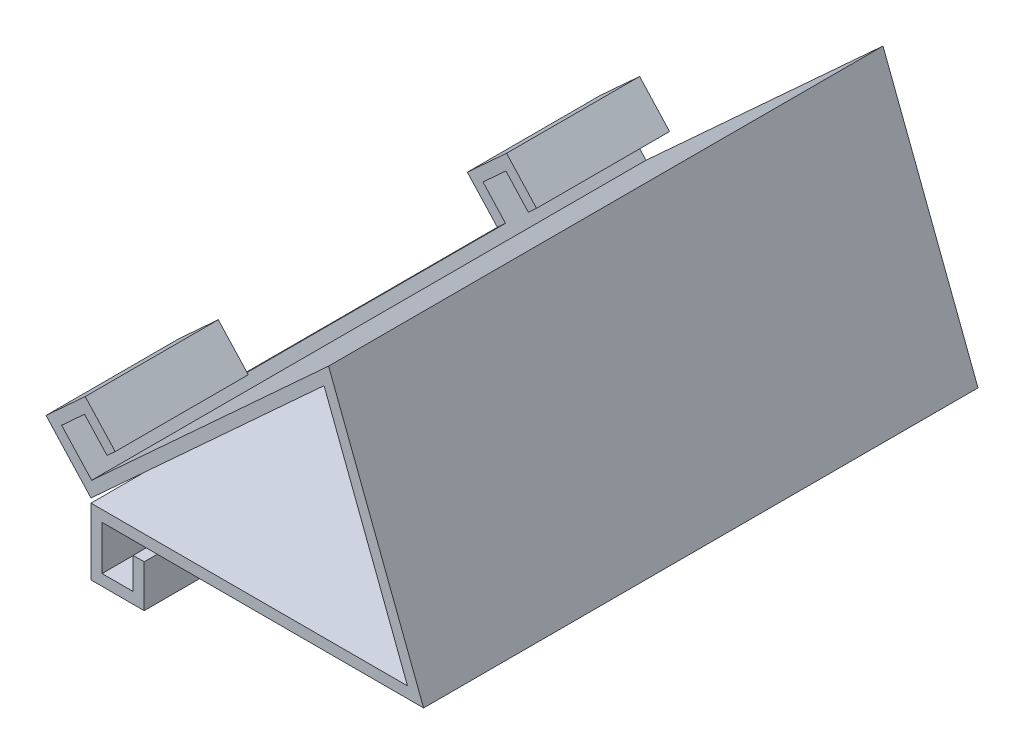
ISO-10303-21;
HEADER;
FILE_DESCRIPTION(('STEP AP214'),'2;1');
FILE_NAME('part.step','',(''),(''),'','','');
FILE_SCHEMA(('AUTOMOTIVE_DESIGN { 1 0 10303 214 1 1 1 1 }'));
ENDSEC;
DATA;
#1=APPLICATION_CONTEXT('core data for automotive mechanical design processes');
#2=APPLICATION_PROTOCOL_DEFINITION('international standard','automotive_design',2000,#1);
#3=PRODUCT_CONTEXT('',#1,'mechanical');
#4=PRODUCT('Part','Part','',(#3));
#5=PRODUCT_RELATED_PRODUCT_CATEGORY('part','',(#4));
#6=PRODUCT_DEFINITION_FORMATION('','',#4);
#7=PRODUCT_DEFINITION_CONTEXT('part definition',#1,'design');
#8=PRODUCT_DEFINITION('design','',#6,#7);
#9=PRODUCT_DEFINITION_SHAPE('','',#8);
#10=(LENGTH_UNIT() NAMED_UNIT(*) SI_UNIT(.MILLI.,.METRE.));
#11=(NAMED_UNIT(*) PLANE_ANGLE_UNIT() SI_UNIT($,.RADIAN.));
#12=(NAMED_UNIT(*) SI_UNIT($,.STERADIAN.) SOLID_ANGLE_UNIT());
#13=UNCERTAINTY_MEASURE_WITH_UNIT(LENGTH_MEASURE(1.E-05),#10,'distance_accuracy_value','');
#14=(GEOMETRIC_REPRESENTATION_CONTEXT(3) GLOBAL_UNCERTAINTY_ASSIGNED_CONTEXT((#13)) GLOBAL_UNIT_ASSIGNED_CONTEXT((#10,
#11,#12)) REPRESENTATION_CONTEXT('',''));
#15=CARTESIAN_POINT('',(0.,0.,0.));
#16=DIRECTION('',(0.,0.,1.));
#17=DIRECTION('',(1.,0.,0.));
#18=AXIS2_PLACEMENT_3D('',#15,#16,#17);
#19=CARTESIAN_POINT('',(0.635,-2.54,31.75));
#20=DIRECTION('',(0.,-1.,0.));
#21=DIRECTION('',(0.,0.,-1.));
#22=AXIS2_PLACEMENT_3D('',#19,#20,#21);
#23=PLANE('',#22);
#24=DIRECTION('',(0.,0.,-1.));
#25=VECTOR('',#24,1.);
#26=CARTESIAN_POINT('',(2.413,-2.54,31.75));
#27=LINE('',#26,#25);
#28=CARTESIAN_POINT('',(2.413,-2.54,31.75));
#29=VERTEX_POINT('',#28);
#30=CARTESIAN_POINT('',(2.413,-2.54,24.13));
#31=VERTEX_POINT('',#30);
#32=EDGE_CURVE('E539',#29,#31,#27,.T.);
#33=ORIENTED_EDGE('',*,*,#32,.T.);
#34=DIRECTION('',(-1.,0.,0.));
#35=VECTOR('',#34,1.);
#36=CARTESIAN_POINT('',(0.635,-2.54,24.13));
#37=LINE('',#36,#35);
#38=CARTESIAN_POINT('',(0.635,-2.54,24.13));
#39=VERTEX_POINT('',#38);
#40=EDGE_CURVE('E336',#31,#39,#37,.T.);
#41=ORIENTED_EDGE('',*,*,#40,.T.);
#42=DIRECTION('',(0.,0.,-1.));
#43=VECTOR('',#42,1.);
#44=CARTESIAN_POINT('',(0.635,-2.54,31.75));
#45=LINE('',#44,#43);
#46=CARTESIAN_POINT('',(0.635,-2.54,31.75));
#47=VERTEX_POINT('',#46);
#48=EDGE_CURVE('E625',#47,#39,#45,.T.);
#49=ORIENTED_EDGE('',*,*,#48,.F.);
#50=DIRECTION('',(-1.,0.,0.));
#51=VECTOR('',#50,1.);
#52=CARTESIAN_POINT('',(0.635,-2.54,31.75));
#53=LINE('',#52,#51);
#54=EDGE_CURVE('E406',#29,#47,#53,.T.);
#55=ORIENTED_EDGE('',*,*,#54,.F.);
#56=EDGE_LOOP('',(#33,#41,#49,#55));
#57=FACE_BOUND('',#56,.T.);
#58=ADVANCED_FACE('F39',(#57),#23,.F.);
#59=CARTESIAN_POINT('',(3.048,-3.175,31.75));
#60=DIRECTION('',(0.,1.,0.));
#61=DIRECTION('',(-1.,0.,0.));
#62=AXIS2_PLACEMENT_3D('',#59,#60,#61);
#63=PLANE('',#62);
#64=DIRECTION('',(0.,0.,-1.));
#65=VECTOR('',#64,1.);
#66=CARTESIAN_POINT('',(0.,-3.175,31.75));
#67=LINE('',#66,#65);
#68=CARTESIAN_POINT('',(0.,-3.175,31.75));
#69=VERTEX_POINT('',#68);
#70=CARTESIAN_POINT('',(0.,-3.175,24.13));
#71=VERTEX_POINT('',#70);
#72=EDGE_CURVE('E559',#69,#71,#67,.T.);
#73=ORIENTED_EDGE('',*,*,#72,.T.);
#74=DIRECTION('',(-1.,0.,0.));
#75=VECTOR('',#74,1.);
#76=CARTESIAN_POINT('',(31.75,-3.175,24.13));
#77=LINE('',#76,#75);
#78=CARTESIAN_POINT('',(3.048,-3.175,24.13));
#79=VERTEX_POINT('',#78);
#80=EDGE_CURVE('E293',#79,#71,#77,.T.);
#81=ORIENTED_EDGE('',*,*,#80,.F.);
#82=DIRECTION('',(0.,0.,-1.));
#83=VECTOR('',#82,1.);
#84=CARTESIAN_POINT('',(3.048,-3.175,31.75));
#85=LINE('',#84,#83);
#86=CARTESIAN_POINT('',(3.048,-3.175,31.75));
#87=VERTEX_POINT('',#86);
#88=EDGE_CURVE('E554',#87,#79,#85,.T.);
#89=ORIENTED_EDGE('',*,*,#88,.F.);
#90=DIRECTION('',(1.,0.,0.));
#91=VECTOR('',#90,1.);
#92=CARTESIAN_POINT('',(3.048,-3.175,31.75));
#93=LINE('',#92,#91);
#94=EDGE_CURVE('E456',#69,#87,#93,.T.);
#95=ORIENTED_EDGE('',*,*,#94,.F.);
#96=EDGE_LOOP('',(#73,#81,#89,#95));
#97=FACE_BOUND('',#96,.T.);
#98=ADVANCED_FACE('F692',(#97),#63,.F.);
#99=CARTESIAN_POINT('',(3.048,-0.750440267258518,31.75));
#100=DIRECTION('',(-1.,0.,0.));
#101=DIRECTION('',(0.,-1.,0.));
#102=AXIS2_PLACEMENT_3D('',#99,#100,#101);
#103=PLANE('',#102);
#104=ORIENTED_EDGE('',*,*,#88,.T.);
#105=DIRECTION('',(0.,1.,0.));
#106=VECTOR('',#105,1.);
#107=CARTESIAN_POINT('',(3.048,-0.750440267258518,24.13));
#108=LINE('',#107,#106);
#109=CARTESIAN_POINT('',(3.048,-0.750440267258518,24.13));
#110=VERTEX_POINT('',#109);
#111=EDGE_CURVE('E332',#79,#110,#108,.T.);
#112=ORIENTED_EDGE('',*,*,#111,.T.);
#113=DIRECTION('',(0.,0.,-1.));
#114=VECTOR('',#113,1.);
#115=CARTESIAN_POINT('',(3.048,-0.750440267258518,31.75));
#116=LINE('',#115,#114);
#117=CARTESIAN_POINT('',(3.048,-0.750440267258518,31.75));
#118=VERTEX_POINT('',#117);
#119=EDGE_CURVE('E549',#118,#110,#116,.T.);
#120=ORIENTED_EDGE('',*,*,#119,.F.);
#121=DIRECTION('',(0.,1.,0.));
#122=VECTOR('',#121,1.);
#123=CARTESIAN_POINT('',(3.048,-0.750440267258518,31.75));
#124=LINE('',#123,#122);
#125=EDGE_CURVE('E459',#87,#118,#124,.T.);
#126=ORIENTED_EDGE('',*,*,#125,.F.);
#127=EDGE_LOOP('',(#104,#112,#120,#126));
#128=FACE_BOUND('',#127,.T.);
#129=ADVANCED_FACE('F689',(#128),#103,.F.);
#130=CARTESIAN_POINT('',(2.413,-0.750440267258518,31.75));
#131=DIRECTION('',(0.,-1.,0.));
#132=DIRECTION('',(0.,0.,-1.));
#133=AXIS2_PLACEMENT_3D('',#130,#131,#132);
#134=PLANE('',#133);
#135=ORIENTED_EDGE('',*,*,#119,.T.);
#136=DIRECTION('',(-1.,0.,0.));
#137=VECTOR('',#136,1.);
#138=CARTESIAN_POINT('',(2.413,-0.750440267258518,24.13));
#139=LINE('',#138,#137);
#140=CARTESIAN_POINT('',(2.413,-0.750440267258518,24.13));
#141=VERTEX_POINT('',#140);
#142=EDGE_CURVE('E328',#110,#141,#139,.T.);
#143=ORIENTED_EDGE('',*,*,#142,.T.);
#144=DIRECTION('',(0.,0.,-1.));
#145=VECTOR('',#144,1.);
#146=CARTESIAN_POINT('',(2.413,-0.750440267258518,31.75));
#147=LINE('',#146,#145);
#148=CARTESIAN_POINT('',(2.413,-0.750440267258518,31.75));
#149=VERTEX_POINT('',#148);
#150=EDGE_CURVE('E544',#149,#141,#147,.T.);
#151=ORIENTED_EDGE('',*,*,#150,.F.);
#152=DIRECTION('',(-1.,0.,0.));
#153=VECTOR('',#152,1.);
#154=CARTESIAN_POINT('',(2.413,-0.750440267258518,31.75));
#155=LINE('',#154,#153);
#156=EDGE_CURVE('E462',#118,#149,#155,.T.);
#157=ORIENTED_EDGE('',*,*,#156,.F.);
#158=EDGE_LOOP('',(#135,#143,#151,#157));
#159=FACE_BOUND('',#158,.T.);
#160=ADVANCED_FACE('F684',(#159),#134,.F.);
#161=CARTESIAN_POINT('',(2.413,-2.54,31.75));
#162=DIRECTION('',(1.,0.,0.));
#163=DIRECTION('',(0.,0.,-1.));
#164=AXIS2_PLACEMENT_3D('',#161,#162,#163);
#165=PLANE('',#164);
#166=ORIENTED_EDGE('',*,*,#150,.T.);
#167=DIRECTION('',(0.,-1.,0.));
#168=VECTOR('',#167,1.);
#169=CARTESIAN_POINT('',(2.413,-2.54,24.13));
#170=LINE('',#169,#168);
#171=EDGE_CURVE('E11',#141,#31,#170,.T.);
#172=ORIENTED_EDGE('',*,*,#171,.T.);
#173=ORIENTED_EDGE('',*,*,#32,.F.);
#174=DIRECTION('',(0.,-1.,0.));
#175=VECTOR('',#174,1.);
#176=CARTESIAN_POINT('',(2.413,-2.54,31.75));
#177=LINE('',#176,#175);
#178=EDGE_CURVE('E465',#149,#29,#177,.T.);
#179=ORIENTED_EDGE('',*,*,#178,.F.);
#180=EDGE_LOOP('',(#166,#172,#173,#179));
#181=FACE_BOUND('',#180,.T.);
#182=ADVANCED_FACE('F681',(#181),#165,.F.);
#183=CARTESIAN_POINT('',(-0.368323494408721,4.85983515188764,31.75));
#184=DIRECTION('',(-0.676031010893319,0.73687317247309,0.));
#185=DIRECTION('',(-0.73687317247309,-0.676031010893319,0.));
#186=AXIS2_PLACEMENT_3D('',#183,#184,#185);
#187=PLANE('',#186);
#188=DIRECTION('',(0.,0.,-1.));
#189=VECTOR('',#188,1.);
#190=CARTESIAN_POINT('',(-0.368323494408721,4.85983515188764,31.75));
#191=LINE('',#190,#189);
#192=CARTESIAN_POINT('',(-0.368323494408721,4.85983515188764,7.62));
#193=VERTEX_POINT('',#192);
#194=CARTESIAN_POINT('',(-0.368323494408721,4.85983515188764,0.));
#195=VERTEX_POINT('',#194);
#196=EDGE_CURVE('E598',#193,#195,#191,.T.);
#197=ORIENTED_EDGE('',*,*,#196,.F.);
#198=DIRECTION('',(-0.73687317247309,-0.676031010893319,0.));
#199=VECTOR('',#198,1.);
#200=CARTESIAN_POINT('',(-0.368323494408721,4.85983515188764,7.62));
#201=LINE('',#200,#199);
#202=CARTESIAN_POINT('',(-1.67848399506588,3.65785201451932,7.62));
#203=VERTEX_POINT('',#202);
#204=EDGE_CURVE('E397',#193,#203,#201,.T.);
#205=ORIENTED_EDGE('',*,*,#204,.T.);
#206=DIRECTION('',(0.,0.,-1.));
#207=VECTOR('',#206,1.);
#208=CARTESIAN_POINT('',(-1.67848399506588,3.65785201451932,31.75));
#209=LINE('',#208,#207);
#210=CARTESIAN_POINT('',(-1.67848399506588,3.65785201451932,0.));
#211=VERTEX_POINT('',#210);
#212=EDGE_CURVE('E603',#203,#211,#209,.T.);
#213=ORIENTED_EDGE('',*,*,#212,.T.);
#214=DIRECTION('',(0.73687317247309,0.676031010893319,0.));
#215=VECTOR('',#214,1.);
#216=CARTESIAN_POINT('',(-0.368323494408721,4.85983515188764,0.));
#217=LINE('',#216,#215);
#218=EDGE_CURVE('E488',#211,#195,#217,.T.);
#219=ORIENTED_EDGE('',*,*,#218,.T.);
#220=EDGE_LOOP('',(#197,#205,#213,#219));
#221=FACE_BOUND('',#220,.T.);
#222=ADVANCED_FACE('F794',(#221),#187,.F.);
#223=CARTESIAN_POINT('',(0.919515581343052,3.45609175832641,31.75));
#224=DIRECTION('',(0.73687317247309,0.676031010893319,0.));
#225=DIRECTION('',(-0.676031010893319,0.73687317247309,0.));
#226=AXIS2_PLACEMENT_3D('',#223,#224,#225);
#227=PLANE('',#226);
#228=DIRECTION('',(0.,0.,-1.));
#229=VECTOR('',#228,1.);
#230=CARTESIAN_POINT('',(0.919515581343052,3.45609175832641,31.75));
#231=LINE('',#230,#229);
#232=CARTESIAN_POINT('',(0.919515581343053,3.4560917583264,7.62));
#233=VERTEX_POINT('',#232);
#234=CARTESIAN_POINT('',(0.919515581343052,3.45609175832641,0.));
#235=VERTEX_POINT('',#234);
#236=EDGE_CURVE('E593',#233,#235,#231,.T.);
#237=ORIENTED_EDGE('',*,*,#236,.F.);
#238=DIRECTION('',(-0.676031010893319,0.73687317247309,0.));
#239=VECTOR('',#238,1.);
#240=CARTESIAN_POINT('',(0.919515581343041,3.45609175832642,7.62));
#241=LINE('',#240,#239);
#242=EDGE_CURVE('E393',#233,#193,#241,.T.);
#243=ORIENTED_EDGE('',*,*,#242,.T.);
#244=ORIENTED_EDGE('',*,*,#196,.T.);
#245=DIRECTION('',(0.676031010893319,-0.73687317247309,0.));
#246=VECTOR('',#245,1.);
#247=CARTESIAN_POINT('',(0.919515581343052,3.45609175832641,0.));
#248=LINE('',#247,#246);
#249=EDGE_CURVE('E492',#195,#235,#248,.T.);
#250=ORIENTED_EDGE('',*,*,#249,.T.);
#251=EDGE_LOOP('',(#237,#243,#244,#250));
#252=FACE_BOUND('',#251,.T.);
#253=ADVANCED_FACE('F649',(#252),#227,.F.);
#254=CARTESIAN_POINT('',(1.38743004586346,3.88537145024366,31.75));
#255=DIRECTION('',(-0.67603101089332,0.73687317247309,0.));
#256=DIRECTION('',(-0.73687317247309,-0.67603101089332,0.));
#257=AXIS2_PLACEMENT_3D('',#254,#255,#256);
#258=PLANE('',#257);
#259=DIRECTION('',(0.,0.,-1.));
#260=VECTOR('',#259,1.);
#261=CARTESIAN_POINT('',(1.38743004586346,3.88537145024366,31.75));
#262=LINE('',#261,#260);
#263=CARTESIAN_POINT('',(1.38743004586346,3.88537145024366,7.62));
#264=VERTEX_POINT('',#263);
#265=CARTESIAN_POINT('',(1.38743004586346,3.88537145024366,0.));
#266=VERTEX_POINT('',#265);
#267=EDGE_CURVE('E588',#264,#266,#262,.T.);
#268=ORIENTED_EDGE('',*,*,#267,.F.);
#269=DIRECTION('',(-0.736873172473091,-0.676031010893319,0.));
#270=VECTOR('',#269,1.);
#271=CARTESIAN_POINT('',(22.5371638421861,23.2888135249037,7.62));
#272=LINE('',#271,#270);
#273=EDGE_CURVE('E367',#264,#233,#272,.T.);
#274=ORIENTED_EDGE('',*,*,#273,.T.);
#275=ORIENTED_EDGE('',*,*,#236,.T.);
#276=DIRECTION('',(0.73687317247309,0.67603101089332,0.));
#277=VECTOR('',#276,1.);
#278=CARTESIAN_POINT('',(1.38743004586346,3.88537145024366,0.));
#279=LINE('',#278,#277);
#280=EDGE_CURVE('E496',#235,#266,#279,.T.);
#281=ORIENTED_EDGE('',*,*,#280,.T.);
#282=EDGE_LOOP('',(#268,#274,#275,#281));
#283=FACE_BOUND('',#282,.T.);
#284=ADVANCED_FACE('F647',(#283),#258,.F.);
#285=CARTESIAN_POINT('',(-0.329688721805564,5.75702930832531,31.75));
#286=DIRECTION('',(-0.73687317247309,-0.676031010893319,0.));
#287=DIRECTION('',(0.676031010893319,-0.73687317247309,0.));
#288=AXIS2_PLACEMENT_3D('',#285,#286,#287);
#289=PLANE('',#288);
#290=DIRECTION('',(0.,0.,-1.));
#291=VECTOR('',#290,1.);
#292=CARTESIAN_POINT('',(-0.329688721805564,5.75702930832531,31.75));
#293=LINE('',#292,#291);
#294=CARTESIAN_POINT('',(-0.329688721805568,5.7570293083253,7.62));
#295=VERTEX_POINT('',#294);
#296=CARTESIAN_POINT('',(-0.329688721805564,5.75702930832531,0.));
#297=VERTEX_POINT('',#296);
#298=EDGE_CURVE('E583',#295,#297,#293,.T.);
#299=ORIENTED_EDGE('',*,*,#298,.F.);
#300=DIRECTION('',(0.676031010893319,-0.73687317247309,0.));
#301=VECTOR('',#300,1.);
#302=CARTESIAN_POINT('',(-0.329688721805576,5.75702930832532,7.62));
#303=LINE('',#302,#301);
#304=EDGE_CURVE('E389',#295,#264,#303,.T.);
#305=ORIENTED_EDGE('',*,*,#304,.T.);
#306=ORIENTED_EDGE('',*,*,#267,.T.);
#307=DIRECTION('',(-0.676031010893319,0.73687317247309,0.));
#308=VECTOR('',#307,1.);
#309=CARTESIAN_POINT('',(-0.329688721805564,5.75702930832531,0.));
#310=LINE('',#309,#308);
#311=EDGE_CURVE('E500',#266,#297,#310,.T.);
#312=ORIENTED_EDGE('',*,*,#311,.T.);
#313=EDGE_LOOP('',(#299,#305,#306,#312));
#314=FACE_BOUND('',#313,.T.);
#315=ADVANCED_FACE('F728',(#314),#289,.F.);
#316=CARTESIAN_POINT('',(-2.57567815150354,3.69648678712247,31.75));
#317=DIRECTION('',(0.676031010893319,-0.736873172473091,0.));
#318=DIRECTION('',(0.736873172473091,0.676031010893319,0.));
#319=AXIS2_PLACEMENT_3D('',#316,#317,#318);
#320=PLANE('',#319);
#321=DIRECTION('',(0.,0.,-1.));
#322=VECTOR('',#321,1.);
#323=CARTESIAN_POINT('',(-2.57567815150354,3.69648678712247,31.75));
#324=LINE('',#323,#322);
#325=CARTESIAN_POINT('',(-2.57567815150354,3.69648678712247,7.62));
#326=VERTEX_POINT('',#325);
#327=CARTESIAN_POINT('',(-2.57567815150354,3.69648678712247,0.));
#328=VERTEX_POINT('',#327);
#329=EDGE_CURVE('E578',#326,#328,#324,.T.);
#330=ORIENTED_EDGE('',*,*,#329,.F.);
#331=DIRECTION('',(-0.736873172473091,-0.676031010893319,0.));
#332=VECTOR('',#331,1.);
#333=CARTESIAN_POINT('',(20.8200450745171,25.1604713829854,7.62));
#334=LINE('',#333,#332);
#335=EDGE_CURVE('E355',#295,#326,#334,.T.);
#336=ORIENTED_EDGE('',*,*,#335,.F.);
#337=ORIENTED_EDGE('',*,*,#298,.T.);
#338=DIRECTION('',(-0.73687317247309,-0.676031010893319,0.));
#339=VECTOR('',#338,1.);
#340=CARTESIAN_POINT('',(-2.57567815150354,3.69648678712247,0.));
#341=LINE('',#340,#339);
#342=EDGE_CURVE('E504',#297,#328,#341,.T.);
#343=ORIENTED_EDGE('',*,*,#342,.T.);
#344=EDGE_LOOP('',(#330,#336,#337,#343));
#345=FACE_BOUND('',#344,.T.);
#346=ADVANCED_FACE('F722',(#345),#320,.F.);
#347=CARTESIAN_POINT('',(0.635,-2.54,7.62));
#348=VERTEX_POINT('',#347);
#349=CARTESIAN_POINT('',(0.635,-2.54,0.));
#350=VERTEX_POINT('',#349);
#351=EDGE_CURVE('E624',#348,#350,#45,.T.);
#352=ORIENTED_EDGE('',*,*,#351,.F.);
#353=DIRECTION('',(1.,0.,0.));
#354=VECTOR('',#353,1.);
#355=CARTESIAN_POINT('',(0.635,-2.54,7.62));
#356=LINE('',#355,#354);
#357=CARTESIAN_POINT('',(2.413,-2.54,7.62));
#358=VERTEX_POINT('',#357);
#359=EDGE_CURVE('E320',#348,#358,#356,.T.);
#360=ORIENTED_EDGE('',*,*,#359,.T.);
#361=CARTESIAN_POINT('',(2.413,-2.54,0.));
#362=VERTEX_POINT('',#361);
#363=EDGE_CURVE('E468',#358,#362,#27,.T.);
#364=ORIENTED_EDGE('',*,*,#363,.T.);
#365=DIRECTION('',(-1.,0.,0.));
#366=VECTOR('',#365,1.);
#367=CARTESIAN_POINT('',(0.635,-2.54,0.));
#368=LINE('',#367,#366);
#369=EDGE_CURVE('E405',#362,#350,#368,.T.);
#370=ORIENTED_EDGE('',*,*,#369,.T.);
#371=EDGE_LOOP('',(#352,#360,#364,#370));
#372=FACE_BOUND('',#371,.T.);
#373=ADVANCED_FACE('F41',(#372),#23,.F.);
#374=CARTESIAN_POINT('',(0.634999999999997,0.,31.75));
#375=DIRECTION('',(-1.,0.,0.));
#376=DIRECTION('',(0.,-1.,0.));
#377=AXIS2_PLACEMENT_3D('',#374,#375,#376);
#378=PLANE('',#377);
#379=ORIENTED_EDGE('',*,*,#48,.T.);
#380=DIRECTION('',(0.,1.,0.));
#381=VECTOR('',#380,1.);
#382=CARTESIAN_POINT('',(0.634999999999997,0.,24.13));
#383=LINE('',#382,#381);
#384=CARTESIAN_POINT('',(0.634999999999997,-0.634999999999997,24.13));
#385=VERTEX_POINT('',#384);
#386=EDGE_CURVE('E340',#39,#385,#383,.T.);
#387=ORIENTED_EDGE('',*,*,#386,.T.);
#388=DIRECTION('',(0.,0.,-1.));
#389=VECTOR('',#388,1.);
#390=CARTESIAN_POINT('',(0.634999999999998,-0.634999999999996,31.75));
#391=LINE('',#390,#389);
#392=CARTESIAN_POINT('',(0.634999999999997,-0.634999999999999,7.62));
#393=VERTEX_POINT('',#392);
#394=EDGE_CURVE('E282',#385,#393,#391,.T.);
#395=ORIENTED_EDGE('',*,*,#394,.T.);
#396=DIRECTION('',(0.,-1.,0.));
#397=VECTOR('',#396,1.);
#398=CARTESIAN_POINT('',(0.634999999999997,0.,7.62));
#399=LINE('',#398,#397);
#400=EDGE_CURVE('E324',#393,#348,#399,.T.);
#401=ORIENTED_EDGE('',*,*,#400,.T.);
#402=ORIENTED_EDGE('',*,*,#351,.T.);
#403=DIRECTION('',(0.,1.,0.));
#404=VECTOR('',#403,1.);
#405=CARTESIAN_POINT('',(0.634999999999997,0.,0.));
#406=LINE('',#405,#404);
#407=CARTESIAN_POINT('',(0.634999999999997,0.,0.));
#408=VERTEX_POINT('',#407);
#409=EDGE_CURVE('E472',#350,#408,#406,.T.);
#410=ORIENTED_EDGE('',*,*,#409,.T.);
#411=DIRECTION('',(0.,0.,-1.));
#412=VECTOR('',#411,1.);
#413=CARTESIAN_POINT('',(0.634999999999997,0.,31.75));
#414=LINE('',#413,#412);
#415=CARTESIAN_POINT('',(0.634999999999997,0.,31.75));
#416=VERTEX_POINT('',#415);
#417=EDGE_CURVE('E620',#416,#408,#414,.T.);
#418=ORIENTED_EDGE('',*,*,#417,.F.);
#419=DIRECTION('',(0.,1.,0.));
#420=VECTOR('',#419,1.);
#421=CARTESIAN_POINT('',(0.634999999999997,0.,31.75));
#422=LINE('',#421,#420);
#423=EDGE_CURVE('E410',#47,#416,#422,.T.);
#424=ORIENTED_EDGE('',*,*,#423,.F.);
#425=EDGE_LOOP('',(#379,#387,#395,#401,#402,#410,#418,#424));
#426=FACE_BOUND('',#425,.T.);
#427=ADVANCED_FACE('F674',(#426),#378,.F.);
#428=CARTESIAN_POINT('',(0.634999999999997,0.,31.75));
#429=DIRECTION('',(0.,1.,0.));
#430=DIRECTION('',(0.,0.,1.));
#431=AXIS2_PLACEMENT_3D('',#428,#429,#430);
#432=PLANE('',#431);
#433=DIRECTION('',(1.,0.,0.));
#434=VECTOR('',#433,1.);
#435=CARTESIAN_POINT('',(0.634999999999997,0.,0.));
#436=LINE('',#435,#434);
#437=CARTESIAN_POINT('',(19.05,0.,0.));
#438=VERTEX_POINT('',#437);
#439=EDGE_CURVE('E475',#408,#438,#436,.T.);
#440=ORIENTED_EDGE('',*,*,#439,.T.);
#441=DIRECTION('',(0.,0.,-1.));
#442=VECTOR('',#441,1.);
#443=CARTESIAN_POINT('',(19.05,0.,31.75));
#444=LINE('',#443,#442);
#445=CARTESIAN_POINT('',(19.05,0.,31.75));
#446=VERTEX_POINT('',#445);
#447=EDGE_CURVE('E616',#446,#438,#444,.T.);
#448=ORIENTED_EDGE('',*,*,#447,.F.);
#449=DIRECTION('',(1.,0.,0.));
#450=VECTOR('',#449,1.);
#451=CARTESIAN_POINT('',(0.634999999999997,0.,31.75));
#452=LINE('',#451,#450);
#453=EDGE_CURVE('E414',#416,#446,#452,.T.);
#454=ORIENTED_EDGE('',*,*,#453,.F.);
#455=ORIENTED_EDGE('',*,*,#417,.T.);
#456=EDGE_LOOP('',(#440,#448,#454,#455));
#457=FACE_BOUND('',#456,.T.);
#458=ADVANCED_FACE('F727',(#457),#432,.F.);
#459=CARTESIAN_POINT('',(19.05,0.,31.75));
#460=DIRECTION('',(-0.934075145803028,-0.357076493195859,0.));
#461=DIRECTION('',(0.357076493195859,-0.934075145803028,0.));
#462=AXIS2_PLACEMENT_3D('',#459,#460,#461);
#463=PLANE('',#462);
#464=DIRECTION('',(-0.357076493195858,0.934075145803028,0.));
#465=VECTOR('',#464,1.);
#466=CARTESIAN_POINT('',(19.05,0.,0.));
#467=LINE('',#466,#465);
#468=CARTESIAN_POINT('',(13.6081542436951,14.2353052220381,0.));
#469=VERTEX_POINT('',#468);
#470=EDGE_CURVE('E478',#438,#469,#467,.T.);
#471=ORIENTED_EDGE('',*,*,#470,.T.);
#472=DIRECTION('',(0.,0.,-1.));
#473=VECTOR('',#472,1.);
#474=CARTESIAN_POINT('',(13.6081542436951,14.2353052220381,31.75));
#475=LINE('',#474,#473);
#476=CARTESIAN_POINT('',(13.6081542436951,14.2353052220381,31.75));
#477=VERTEX_POINT('',#476);
#478=EDGE_CURVE('E612',#477,#469,#475,.T.);
#479=ORIENTED_EDGE('',*,*,#478,.F.);
#480=DIRECTION('',(-0.357076493195858,0.934075145803028,0.));
#481=VECTOR('',#480,1.);
#482=CARTESIAN_POINT('',(19.05,0.,31.75));
#483=LINE('',#482,#481);
#484=EDGE_CURVE('E417',#446,#477,#483,.T.);
#485=ORIENTED_EDGE('',*,*,#484,.F.);
#486=ORIENTED_EDGE('',*,*,#447,.T.);
#487=EDGE_LOOP('',(#471,#479,#485,#486));
#488=FACE_BOUND('',#487,.T.);
#489=ADVANCED_FACE('F979',(#488),#463,.F.);
#490=CARTESIAN_POINT('',(13.6081542436951,14.2353052220381,31.75));
#491=DIRECTION('',(0.676031010893319,-0.73687317247309,0.));
#492=DIRECTION('',(0.73687317247309,0.676031010893319,0.));
#493=AXIS2_PLACEMENT_3D('',#490,#491,#492);
#494=PLANE('',#493);
#495=DIRECTION('',(-0.73687317247309,-0.676031010893319,0.));
#496=VECTOR('',#495,1.);
#497=CARTESIAN_POINT('',(13.6081542436951,14.2353052220381,0.));
#498=LINE('',#497,#496);
#499=CARTESIAN_POINT('',(0.0386347726031543,1.78619415643767,0.));
#500=VERTEX_POINT('',#499);
#501=EDGE_CURVE('E481',#469,#500,#498,.T.);
#502=ORIENTED_EDGE('',*,*,#501,.T.);
#503=DIRECTION('',(0.,0.,-1.));
#504=VECTOR('',#503,1.);
#505=CARTESIAN_POINT('',(0.0386347726031543,1.78619415643767,31.75));
#506=LINE('',#505,#504);
#507=CARTESIAN_POINT('',(0.0386347726031543,1.78619415643767,31.75));
#508=VERTEX_POINT('',#507);
#509=EDGE_CURVE('E608',#508,#500,#506,.T.);
#510=ORIENTED_EDGE('',*,*,#509,.F.);
#511=DIRECTION('',(-0.73687317247309,-0.676031010893319,0.));
#512=VECTOR('',#511,1.);
#513=CARTESIAN_POINT('',(13.6081542436951,14.2353052220381,31.75));
#514=LINE('',#513,#512);
#515=EDGE_CURVE('E420',#477,#508,#514,.T.);
#516=ORIENTED_EDGE('',*,*,#515,.F.);
#517=ORIENTED_EDGE('',*,*,#478,.T.);
#518=EDGE_LOOP('',(#502,#510,#516,#517));
#519=FACE_BOUND('',#518,.T.);
#520=ADVANCED_FACE('F788',(#519),#494,.F.);
#521=CARTESIAN_POINT('',(-1.67848399506588,3.65785201451932,31.75));
#522=DIRECTION('',(-0.736873172473092,-0.676031010893318,0.));
#523=DIRECTION('',(0.676031010893318,-0.736873172473092,0.));
#524=AXIS2_PLACEMENT_3D('',#521,#522,#523);
#525=PLANE('',#524);
#526=ORIENTED_EDGE('',*,*,#212,.F.);
#527=DIRECTION('',(0.676031010893318,-0.736873172473092,0.));
#528=VECTOR('',#527,1.);
#529=CARTESIAN_POINT('',(-1.67848399506589,3.65785201451933,7.62));
#530=LINE('',#529,#528);
#531=CARTESIAN_POINT('',(-0.390644919314106,2.25410862095808,7.62));
#532=VERTEX_POINT('',#531);
#533=EDGE_CURVE('E401',#203,#532,#530,.T.);
#534=ORIENTED_EDGE('',*,*,#533,.T.);
#535=DIRECTION('',(0.,0.,1.));
#536=VECTOR('',#535,1.);
#537=CARTESIAN_POINT('',(-0.390644919314102,2.25410862095808,31.75));
#538=LINE('',#537,#536);
#539=CARTESIAN_POINT('',(-0.390644919314106,2.25410862095808,24.13));
#540=VERTEX_POINT('',#539);
#541=EDGE_CURVE('E358',#532,#540,#538,.T.);
#542=ORIENTED_EDGE('',*,*,#541,.T.);
#543=DIRECTION('',(-0.676031010893318,0.736873172473092,0.));
#544=VECTOR('',#543,1.);
#545=CARTESIAN_POINT('',(-1.67848399506588,3.65785201451932,24.13));
#546=LINE('',#545,#544);
#547=CARTESIAN_POINT('',(-1.67848399506588,3.65785201451932,24.13));
#548=VERTEX_POINT('',#547);
#549=EDGE_CURVE('E385',#540,#548,#546,.T.);
#550=ORIENTED_EDGE('',*,*,#549,.T.);
#551=CARTESIAN_POINT('',(-1.67848399506588,3.65785201451932,31.75));
#552=VERTEX_POINT('',#551);
#553=EDGE_CURVE('E604',#552,#548,#209,.T.);
#554=ORIENTED_EDGE('',*,*,#553,.F.);
#555=DIRECTION('',(-0.676031010893318,0.736873172473092,0.));
#556=VECTOR('',#555,1.);
#557=CARTESIAN_POINT('',(-1.67848399506588,3.65785201451932,31.75));
#558=LINE('',#557,#556);
#559=EDGE_CURVE('E423',#508,#552,#558,.T.);
#560=ORIENTED_EDGE('',*,*,#559,.F.);
#561=ORIENTED_EDGE('',*,*,#509,.T.);
#562=DIRECTION('',(-0.676031010893318,0.736873172473092,0.));
#563=VECTOR('',#562,1.);
#564=CARTESIAN_POINT('',(-1.67848399506588,3.65785201451932,0.));
#565=LINE('',#564,#563);
#566=EDGE_CURVE('E484',#500,#211,#565,.T.);
#567=ORIENTED_EDGE('',*,*,#566,.T.);
#568=EDGE_LOOP('',(#526,#534,#542,#550,#554,#560,#561,#567));
#569=FACE_BOUND('',#568,.T.);
#570=ADVANCED_FACE('F773',(#569),#525,.F.);
#571=ORIENTED_EDGE('',*,*,#553,.T.);
#572=DIRECTION('',(0.73687317247309,0.676031010893319,0.));
#573=VECTOR('',#572,1.);
#574=CARTESIAN_POINT('',(-0.368323494408721,4.85983515188764,24.13));
#575=LINE('',#574,#573);
#576=CARTESIAN_POINT('',(-0.368323494408721,4.85983515188764,24.13));
#577=VERTEX_POINT('',#576);
#578=EDGE_CURVE('E381',#548,#577,#575,.T.);
#579=ORIENTED_EDGE('',*,*,#578,.T.);
#580=CARTESIAN_POINT('',(-0.368323494408721,4.85983515188764,31.75));
#581=VERTEX_POINT('',#580);
#582=EDGE_CURVE('E599',#581,#577,#191,.T.);
#583=ORIENTED_EDGE('',*,*,#582,.F.);
#584=DIRECTION('',(0.73687317247309,0.676031010893319,0.));
#585=VECTOR('',#584,1.);
#586=CARTESIAN_POINT('',(-0.368323494408721,4.85983515188764,31.75));
#587=LINE('',#586,#585);
#588=EDGE_CURVE('E426',#552,#581,#587,.T.);
#589=ORIENTED_EDGE('',*,*,#588,.F.);
#590=EDGE_LOOP('',(#571,#579,#583,#589));
#591=FACE_BOUND('',#590,.T.);
#592=ADVANCED_FACE('F767',(#591),#187,.F.);
#593=ORIENTED_EDGE('',*,*,#582,.T.);
#594=DIRECTION('',(0.676031010893319,-0.73687317247309,0.));
#595=VECTOR('',#594,1.);
#596=CARTESIAN_POINT('',(0.919515581343052,3.45609175832641,24.13));
#597=LINE('',#596,#595);
#598=CARTESIAN_POINT('',(0.919515581343053,3.4560917583264,24.13));
#599=VERTEX_POINT('',#598);
#600=EDGE_CURVE('E377',#577,#599,#597,.T.);
#601=ORIENTED_EDGE('',*,*,#600,.T.);
#602=CARTESIAN_POINT('',(0.919515581343052,3.45609175832641,31.75));
#603=VERTEX_POINT('',#602);
#604=EDGE_CURVE('E594',#603,#599,#231,.T.);
#605=ORIENTED_EDGE('',*,*,#604,.F.);
#606=DIRECTION('',(0.676031010893319,-0.73687317247309,0.));
#607=VECTOR('',#606,1.);
#608=CARTESIAN_POINT('',(0.919515581343052,3.45609175832641,31.75));
#609=LINE('',#608,#607);
#610=EDGE_CURVE('E429',#581,#603,#609,.T.);
#611=ORIENTED_EDGE('',*,*,#610,.F.);
#612=EDGE_LOOP('',(#593,#601,#605,#611));
#613=FACE_BOUND('',#612,.T.);
#614=ADVANCED_FACE('F764',(#613),#227,.F.);
#615=ORIENTED_EDGE('',*,*,#604,.T.);
#616=DIRECTION('',(-0.736873172473091,-0.676031010893319,0.));
#617=VECTOR('',#616,1.);
#618=CARTESIAN_POINT('',(22.5371638421861,23.2888135249037,24.13));
#619=LINE('',#618,#617);
#620=CARTESIAN_POINT('',(1.38743004586346,3.88537145024366,24.13));
#621=VERTEX_POINT('',#620);
#622=EDGE_CURVE('E363',#621,#599,#619,.T.);
#623=ORIENTED_EDGE('',*,*,#622,.F.);
#624=CARTESIAN_POINT('',(1.38743004586346,3.88537145024366,31.75));
#625=VERTEX_POINT('',#624);
#626=EDGE_CURVE('E589',#625,#621,#262,.T.);
#627=ORIENTED_EDGE('',*,*,#626,.F.);
#628=DIRECTION('',(0.73687317247309,0.67603101089332,0.));
#629=VECTOR('',#628,1.);
#630=CARTESIAN_POINT('',(1.38743004586346,3.88537145024366,31.75));
#631=LINE('',#630,#629);
#632=EDGE_CURVE('E432',#603,#625,#631,.T.);
#633=ORIENTED_EDGE('',*,*,#632,.F.);
#634=EDGE_LOOP('',(#615,#623,#627,#633));
#635=FACE_BOUND('',#634,.T.);
#636=ADVANCED_FACE('F749',(#635),#258,.F.);
#637=ORIENTED_EDGE('',*,*,#626,.T.);
#638=DIRECTION('',(-0.676031010893319,0.73687317247309,0.));
#639=VECTOR('',#638,1.);
#640=CARTESIAN_POINT('',(-0.329688721805564,5.75702930832531,24.13));
#641=LINE('',#640,#639);
#642=CARTESIAN_POINT('',(-0.329688721805568,5.7570293083253,24.13));
#643=VERTEX_POINT('',#642);
#644=EDGE_CURVE('E373',#621,#643,#641,.T.);
#645=ORIENTED_EDGE('',*,*,#644,.T.);
#646=CARTESIAN_POINT('',(-0.329688721805564,5.75702930832531,31.75));
#647=VERTEX_POINT('',#646);
#648=EDGE_CURVE('E584',#647,#643,#293,.T.);
#649=ORIENTED_EDGE('',*,*,#648,.F.);
#650=DIRECTION('',(-0.676031010893319,0.73687317247309,0.));
#651=VECTOR('',#650,1.);
#652=CARTESIAN_POINT('',(-0.329688721805564,5.75702930832531,31.75));
#653=LINE('',#652,#651);
#654=EDGE_CURVE('E435',#625,#647,#653,.T.);
#655=ORIENTED_EDGE('',*,*,#654,.F.);
#656=EDGE_LOOP('',(#637,#645,#649,#655));
#657=FACE_BOUND('',#656,.T.);
#658=ADVANCED_FACE('F737',(#657),#289,.F.);
#659=ORIENTED_EDGE('',*,*,#648,.T.);
#660=DIRECTION('',(-0.736873172473091,-0.676031010893319,0.));
#661=VECTOR('',#660,1.);
#662=CARTESIAN_POINT('',(20.8200450745171,25.1604713829854,24.13));
#663=LINE('',#662,#661);
#664=CARTESIAN_POINT('',(-2.57567815150354,3.69648678712247,24.13));
#665=VERTEX_POINT('',#664);
#666=EDGE_CURVE('E359',#643,#665,#663,.T.);
#667=ORIENTED_EDGE('',*,*,#666,.T.);
#668=CARTESIAN_POINT('',(-2.57567815150354,3.69648678712247,31.75));
#669=VERTEX_POINT('',#668);
#670=EDGE_CURVE('E579',#669,#665,#324,.T.);
#671=ORIENTED_EDGE('',*,*,#670,.F.);
#672=DIRECTION('',(-0.73687317247309,-0.676031010893319,0.));
#673=VECTOR('',#672,1.);
#674=CARTESIAN_POINT('',(-2.57567815150354,3.69648678712247,31.75));
#675=LINE('',#674,#673);
#676=EDGE_CURVE('E438',#647,#669,#675,.T.);
#677=ORIENTED_EDGE('',*,*,#676,.F.);
#678=EDGE_LOOP('',(#659,#667,#671,#677));
#679=FACE_BOUND('',#678,.T.);
#680=ADVANCED_FACE('F731',(#679),#320,.F.);
#681=CARTESIAN_POINT('',(0.,0.889,31.75));
#682=DIRECTION('',(0.736873172473091,0.676031010893319,0.));
#683=DIRECTION('',(-0.676031010893319,0.736873172473091,0.));
#684=AXIS2_PLACEMENT_3D('',#681,#682,#683);
#685=PLANE('',#684);
#686=DIRECTION('',(0.,0.,1.));
#687=VECTOR('',#686,1.);
#688=CARTESIAN_POINT('',(-0.858559383834513,1.82482892904082,7.62));
#689=LINE('',#688,#687);
#690=CARTESIAN_POINT('',(-0.858559383834513,1.82482892904082,7.62));
#691=VERTEX_POINT('',#690);
#692=CARTESIAN_POINT('',(-0.858559383834513,1.82482892904082,24.13));
#693=VERTEX_POINT('',#692);
#694=EDGE_CURVE('E347',#691,#693,#689,.T.);
#695=ORIENTED_EDGE('',*,*,#694,.F.);
#696=DIRECTION('',(0.676031010893319,-0.736873172473091,0.));
#697=VECTOR('',#696,1.);
#698=CARTESIAN_POINT('',(-2.57567815150354,3.69648678712247,7.62));
#699=LINE('',#698,#697);
#700=EDGE_CURVE('E63',#326,#691,#699,.T.);
#701=ORIENTED_EDGE('',*,*,#700,.F.);
#702=ORIENTED_EDGE('',*,*,#329,.T.);
#703=DIRECTION('',(0.676031010893319,-0.736873172473091,0.));
#704=VECTOR('',#703,1.);
#705=CARTESIAN_POINT('',(0.,0.889,0.));
#706=LINE('',#705,#704);
#707=CARTESIAN_POINT('',(0.,0.889,0.));
#708=VERTEX_POINT('',#707);
#709=EDGE_CURVE('E508',#328,#708,#706,.T.);
#710=ORIENTED_EDGE('',*,*,#709,.T.);
#711=DIRECTION('',(0.,0.,-1.));
#712=VECTOR('',#711,1.);
#713=CARTESIAN_POINT('',(0.,0.889,31.75));
#714=LINE('',#713,#712);
#715=CARTESIAN_POINT('',(0.,0.889,31.75));
#716=VERTEX_POINT('',#715);
#717=EDGE_CURVE('E574',#716,#708,#714,.T.);
#718=ORIENTED_EDGE('',*,*,#717,.F.);
#719=DIRECTION('',(0.676031010893319,-0.736873172473091,0.));
#720=VECTOR('',#719,1.);
#721=CARTESIAN_POINT('',(0.,0.889,31.75));
#722=LINE('',#721,#720);
#723=EDGE_CURVE('E441',#669,#716,#722,.T.);
#724=ORIENTED_EDGE('',*,*,#723,.F.);
#725=ORIENTED_EDGE('',*,*,#670,.T.);
#726=DIRECTION('',(-0.676031010893319,0.736873172473091,0.));
#727=VECTOR('',#726,1.);
#728=CARTESIAN_POINT('',(-2.57567815150354,3.69648678712247,24.13));
#729=LINE('',#728,#727);
#730=EDGE_CURVE('E351',#693,#665,#729,.T.);
#731=ORIENTED_EDGE('',*,*,#730,.F.);
#732=EDGE_LOOP('',(#695,#701,#702,#710,#718,#724,#725,#731));
#733=FACE_BOUND('',#732,.T.);
#734=ADVANCED_FACE('F741',(#733),#685,.F.);
#735=CARTESIAN_POINT('',(13.3487441505381,13.1355647269498,31.75));
#736=DIRECTION('',(-0.676031010893319,0.73687317247309,0.));
#737=DIRECTION('',(-0.736873172473091,-0.676031010893319,0.));
#738=AXIS2_PLACEMENT_3D('',#735,#736,#737);
#739=PLANE('',#738);
#740=DIRECTION('',(0.736873172473091,0.676031010893319,0.));
#741=VECTOR('',#740,1.);
#742=CARTESIAN_POINT('',(13.3487441505381,13.1355647269498,0.));
#743=LINE('',#742,#741);
#744=CARTESIAN_POINT('',(13.3487441505381,13.1355647269498,0.));
#745=VERTEX_POINT('',#744);
#746=EDGE_CURVE('E511',#708,#745,#743,.T.);
#747=ORIENTED_EDGE('',*,*,#746,.T.);
#748=DIRECTION('',(0.,0.,-1.));
#749=VECTOR('',#748,1.);
#750=CARTESIAN_POINT('',(13.3487441505381,13.1355647269498,31.75));
#751=LINE('',#750,#749);
#752=CARTESIAN_POINT('',(13.3487441505381,13.1355647269498,31.75));
#753=VERTEX_POINT('',#752);
#754=EDGE_CURVE('E570',#753,#745,#751,.T.);
#755=ORIENTED_EDGE('',*,*,#754,.F.);
#756=DIRECTION('',(0.736873172473091,0.676031010893319,0.));
#757=VECTOR('',#756,1.);
#758=CARTESIAN_POINT('',(13.3487441505381,13.1355647269498,31.75));
#759=LINE('',#758,#757);
#760=EDGE_CURVE('E444',#716,#753,#759,.T.);
#761=ORIENTED_EDGE('',*,*,#760,.F.);
#762=ORIENTED_EDGE('',*,*,#717,.T.);
#763=EDGE_LOOP('',(#747,#755,#761,#762));
#764=FACE_BOUND('',#763,.T.);
#765=ADVANCED_FACE('F747',(#764),#739,.F.);
#766=CARTESIAN_POINT('',(18.1274365670135,0.635000000000001,31.75));
#767=DIRECTION('',(0.934075145803028,0.357076493195858,0.));
#768=DIRECTION('',(-0.357076493195858,0.934075145803028,0.));
#769=AXIS2_PLACEMENT_3D('',#766,#767,#768);
#770=PLANE('',#769);
#771=DIRECTION('',(0.357076493195858,-0.934075145803028,0.));
#772=VECTOR('',#771,1.);
#773=CARTESIAN_POINT('',(18.1274365670135,0.635000000000001,0.));
#774=LINE('',#773,#772);
#775=CARTESIAN_POINT('',(18.1274365670135,0.635000000000001,0.));
#776=VERTEX_POINT('',#775);
#777=EDGE_CURVE('E514',#745,#776,#774,.T.);
#778=ORIENTED_EDGE('',*,*,#777,.T.);
#779=DIRECTION('',(0.,0.,-1.));
#780=VECTOR('',#779,1.);
#781=CARTESIAN_POINT('',(18.1274365670135,0.635000000000001,31.75));
#782=LINE('',#781,#780);
#783=CARTESIAN_POINT('',(18.1274365670135,0.635000000000001,31.75));
#784=VERTEX_POINT('',#783);
#785=EDGE_CURVE('E566',#784,#776,#782,.T.);
#786=ORIENTED_EDGE('',*,*,#785,.F.);
#787=DIRECTION('',(0.357076493195858,-0.934075145803028,0.));
#788=VECTOR('',#787,1.);
#789=CARTESIAN_POINT('',(18.1274365670135,0.635000000000001,31.75));
#790=LINE('',#789,#788);
#791=EDGE_CURVE('E447',#753,#784,#790,.T.);
#792=ORIENTED_EDGE('',*,*,#791,.F.);
#793=ORIENTED_EDGE('',*,*,#754,.T.);
#794=EDGE_LOOP('',(#778,#786,#792,#793));
#795=FACE_BOUND('',#794,.T.);
#796=ADVANCED_FACE('F955',(#795),#770,.F.);
#797=CARTESIAN_POINT('',(0.,0.635,31.75));
#798=DIRECTION('',(0.,-1.,0.));
#799=DIRECTION('',(1.,0.,0.));
#800=AXIS2_PLACEMENT_3D('',#797,#798,#799);
#801=PLANE('',#800);
#802=DIRECTION('',(-1.,0.,0.));
#803=VECTOR('',#802,1.);
#804=CARTESIAN_POINT('',(0.,0.635,0.));
#805=LINE('',#804,#803);
#806=CARTESIAN_POINT('',(0.,0.635,0.));
#807=VERTEX_POINT('',#806);
#808=EDGE_CURVE('E517',#776,#807,#805,.T.);
#809=ORIENTED_EDGE('',*,*,#808,.T.);
#810=DIRECTION('',(0.,0.,-1.));
#811=VECTOR('',#810,1.);
#812=CARTESIAN_POINT('',(0.,0.635,31.75));
#813=LINE('',#812,#811);
#814=CARTESIAN_POINT('',(0.,0.635,31.75));
#815=VERTEX_POINT('',#814);
#816=EDGE_CURVE('E562',#815,#807,#813,.T.);
#817=ORIENTED_EDGE('',*,*,#816,.F.);
#818=DIRECTION('',(-1.,0.,0.));
#819=VECTOR('',#818,1.);
#820=CARTESIAN_POINT('',(0.,0.635,31.75));
#821=LINE('',#820,#819);
#822=EDGE_CURVE('E450',#784,#815,#821,.T.);
#823=ORIENTED_EDGE('',*,*,#822,.F.);
#824=ORIENTED_EDGE('',*,*,#785,.T.);
#825=EDGE_LOOP('',(#809,#817,#823,#824));
#826=FACE_BOUND('',#825,.T.);
#827=ADVANCED_FACE('F703',(#826),#801,.F.);
#828=CARTESIAN_POINT('',(0.,-3.175,31.75));
#829=DIRECTION('',(1.,0.,0.));
#830=DIRECTION('',(0.,0.,-1.));
#831=AXIS2_PLACEMENT_3D('',#828,#829,#830);
#832=PLANE('',#831);
#833=DIRECTION('',(0.,0.,-1.));
#834=VECTOR('',#833,1.);
#835=CARTESIAN_POINT('',(0.,-0.634999999999997,24.13));
#836=LINE('',#835,#834);
#837=CARTESIAN_POINT('',(0.,-0.634999999999997,24.13));
#838=VERTEX_POINT('',#837);
#839=CARTESIAN_POINT('',(0.,-0.634999999999999,7.62));
#840=VERTEX_POINT('',#839);
#841=EDGE_CURVE('E279',#838,#840,#836,.T.);
#842=ORIENTED_EDGE('',*,*,#841,.F.);
#843=DIRECTION('',(0.,1.,0.));
#844=VECTOR('',#843,1.);
#845=CARTESIAN_POINT('',(0.,-3.175,24.13));
#846=LINE('',#845,#844);
#847=EDGE_CURVE('E290',#71,#838,#846,.T.);
#848=ORIENTED_EDGE('',*,*,#847,.F.);
#849=ORIENTED_EDGE('',*,*,#72,.F.);
#850=DIRECTION('',(0.,-1.,0.));
#851=VECTOR('',#850,1.);
#852=CARTESIAN_POINT('',(0.,-3.175,31.75));
#853=LINE('',#852,#851);
#854=EDGE_CURVE('E453',#815,#69,#853,.T.);
#855=ORIENTED_EDGE('',*,*,#854,.F.);
#856=ORIENTED_EDGE('',*,*,#816,.T.);
#857=DIRECTION('',(0.,-1.,0.));
#858=VECTOR('',#857,1.);
#859=CARTESIAN_POINT('',(0.,-3.175,0.));
#860=LINE('',#859,#858);
#861=CARTESIAN_POINT('',(0.,-3.175,0.));
#862=VERTEX_POINT('',#861);
#863=EDGE_CURVE('E520',#807,#862,#860,.T.);
#864=ORIENTED_EDGE('',*,*,#863,.T.);
#865=CARTESIAN_POINT('',(0.,-3.175,7.62));
#866=VERTEX_POINT('',#865);
#867=EDGE_CURVE('E558',#866,#862,#67,.T.);
#868=ORIENTED_EDGE('',*,*,#867,.F.);
#869=DIRECTION('',(0.,-1.,0.));
#870=VECTOR('',#869,1.);
#871=CARTESIAN_POINT('',(0.,-3.175,7.62));
#872=LINE('',#871,#870);
#873=EDGE_CURVE('E287',#840,#866,#872,.T.);
#874=ORIENTED_EDGE('',*,*,#873,.F.);
#875=EDGE_LOOP('',(#842,#848,#849,#855,#856,#864,#868,#874));
#876=FACE_BOUND('',#875,.T.);
#877=ADVANCED_FACE('F299',(#876),#832,.F.);
#878=CARTESIAN_POINT('',(3.048,-3.175,7.62));
#879=VERTEX_POINT('',#878);
#880=CARTESIAN_POINT('',(3.048,-3.175,0.));
#881=VERTEX_POINT('',#880);
#882=EDGE_CURVE('E553',#879,#881,#85,.T.);
#883=ORIENTED_EDGE('',*,*,#882,.F.);
#884=DIRECTION('',(-1.,0.,0.));
#885=VECTOR('',#884,1.);
#886=CARTESIAN_POINT('',(31.75,-3.175,7.62));
#887=LINE('',#886,#885);
#888=EDGE_CURVE('E308',#879,#866,#887,.T.);
#889=ORIENTED_EDGE('',*,*,#888,.T.);
#890=ORIENTED_EDGE('',*,*,#867,.T.);
#891=DIRECTION('',(1.,0.,0.));
#892=VECTOR('',#891,1.);
#893=CARTESIAN_POINT('',(3.048,-3.175,0.));
#894=LINE('',#893,#892);
#895=EDGE_CURVE('E524',#862,#881,#894,.T.);
#896=ORIENTED_EDGE('',*,*,#895,.T.);
#897=EDGE_LOOP('',(#883,#889,#890,#896));
#898=FACE_BOUND('',#897,.T.);
#899=ADVANCED_FACE('F708',(#898),#63,.F.);
#900=CARTESIAN_POINT('',(3.048,-0.750440267258518,7.62));
#901=VERTEX_POINT('',#900);
#902=CARTESIAN_POINT('',(3.048,-0.750440267258518,0.));
#903=VERTEX_POINT('',#902);
#904=EDGE_CURVE('E548',#901,#903,#116,.T.);
#905=ORIENTED_EDGE('',*,*,#904,.F.);
#906=DIRECTION('',(0.,-1.,0.));
#907=VECTOR('',#906,1.);
#908=CARTESIAN_POINT('',(3.048,-0.750440267258518,7.62));
#909=LINE('',#908,#907);
#910=EDGE_CURVE('E316',#901,#879,#909,.T.);
#911=ORIENTED_EDGE('',*,*,#910,.T.);
#912=ORIENTED_EDGE('',*,*,#882,.T.);
#913=DIRECTION('',(0.,1.,0.));
#914=VECTOR('',#913,1.);
#915=CARTESIAN_POINT('',(3.048,-0.750440267258518,0.));
#916=LINE('',#915,#914);
#917=EDGE_CURVE('E528',#881,#903,#916,.T.);
#918=ORIENTED_EDGE('',*,*,#917,.T.);
#919=EDGE_LOOP('',(#905,#911,#912,#918));
#920=FACE_BOUND('',#919,.T.);
#921=ADVANCED_FACE('F662',(#920),#103,.F.);
#922=CARTESIAN_POINT('',(2.413,-0.750440267258518,7.62));
#923=VERTEX_POINT('',#922);
#924=CARTESIAN_POINT('',(2.413,-0.750440267258518,0.));
#925=VERTEX_POINT('',#924);
#926=EDGE_CURVE('E543',#923,#925,#147,.T.);
#927=ORIENTED_EDGE('',*,*,#926,.F.);
#928=DIRECTION('',(1.,0.,0.));
#929=VECTOR('',#928,1.);
#930=CARTESIAN_POINT('',(2.413,-0.750440267258518,7.62));
#931=LINE('',#930,#929);
#932=EDGE_CURVE('E55',#923,#901,#931,.T.);
#933=ORIENTED_EDGE('',*,*,#932,.T.);
#934=ORIENTED_EDGE('',*,*,#904,.T.);
#935=DIRECTION('',(-1.,0.,0.));
#936=VECTOR('',#935,1.);
#937=CARTESIAN_POINT('',(2.413,-0.750440267258518,0.));
#938=LINE('',#937,#936);
#939=EDGE_CURVE('E532',#903,#925,#938,.T.);
#940=ORIENTED_EDGE('',*,*,#939,.T.);
#941=EDGE_LOOP('',(#927,#933,#934,#940));
#942=FACE_BOUND('',#941,.T.);
#943=ADVANCED_FACE('F634',(#942),#134,.F.);
#944=ORIENTED_EDGE('',*,*,#363,.F.);
#945=DIRECTION('',(0.,1.,0.));
#946=VECTOR('',#945,1.);
#947=CARTESIAN_POINT('',(2.413,-2.54,7.62));
#948=LINE('',#947,#946);
#949=EDGE_CURVE('E48',#358,#923,#948,.T.);
#950=ORIENTED_EDGE('',*,*,#949,.T.);
#951=ORIENTED_EDGE('',*,*,#926,.T.);
#952=DIRECTION('',(0.,-1.,0.));
#953=VECTOR('',#952,1.);
#954=CARTESIAN_POINT('',(2.413,-2.54,0.));
#955=LINE('',#954,#953);
#956=EDGE_CURVE('E411',#925,#362,#955,.T.);
#957=ORIENTED_EDGE('',*,*,#956,.T.);
#958=EDGE_LOOP('',(#944,#950,#951,#957));
#959=FACE_BOUND('',#958,.T.);
#960=ADVANCED_FACE('F632',(#959),#165,.F.);
#961=CARTESIAN_POINT('',(0.,0.,31.75));
#962=DIRECTION('',(0.,0.,1.));
#963=DIRECTION('',(1.,0.,0.));
#964=AXIS2_PLACEMENT_3D('',#961,#962,#963);
#965=PLANE('',#964);
#966=ORIENTED_EDGE('',*,*,#54,.T.);
#967=ORIENTED_EDGE('',*,*,#423,.T.);
#968=ORIENTED_EDGE('',*,*,#453,.T.);
#969=ORIENTED_EDGE('',*,*,#484,.T.);
#970=ORIENTED_EDGE('',*,*,#515,.T.);
#971=ORIENTED_EDGE('',*,*,#559,.T.);
#972=ORIENTED_EDGE('',*,*,#588,.T.);
#973=ORIENTED_EDGE('',*,*,#610,.T.);
#974=ORIENTED_EDGE('',*,*,#632,.T.);
#975=ORIENTED_EDGE('',*,*,#654,.T.);
#976=ORIENTED_EDGE('',*,*,#676,.T.);
#977=ORIENTED_EDGE('',*,*,#723,.T.);
#978=ORIENTED_EDGE('',*,*,#760,.T.);
#979=ORIENTED_EDGE('',*,*,#791,.T.);
#980=ORIENTED_EDGE('',*,*,#822,.T.);
#981=ORIENTED_EDGE('',*,*,#854,.T.);
#982=ORIENTED_EDGE('',*,*,#94,.T.);
#983=ORIENTED_EDGE('',*,*,#125,.T.);
#984=ORIENTED_EDGE('',*,*,#156,.T.);
#985=ORIENTED_EDGE('',*,*,#178,.T.);
#986=EDGE_LOOP('',(#966,#967,#968,#969,#970,#971,#972,#973,#974,#975,#976,#977,#978,#979,#980,
#981,#982,#983,#984,#985));
#987=FACE_BOUND('',#986,.T.);
#988=ADVANCED_FACE('F698',(#987),#965,.T.);
#989=CARTESIAN_POINT('',(0.,0.,0.));
#990=DIRECTION('',(0.,0.,1.));
#991=DIRECTION('',(1.,0.,0.));
#992=AXIS2_PLACEMENT_3D('',#989,#990,#991);
#993=PLANE('',#992);
#994=ORIENTED_EDGE('',*,*,#369,.F.);
#995=ORIENTED_EDGE('',*,*,#956,.F.);
#996=ORIENTED_EDGE('',*,*,#939,.F.);
#997=ORIENTED_EDGE('',*,*,#917,.F.);
#998=ORIENTED_EDGE('',*,*,#895,.F.);
#999=ORIENTED_EDGE('',*,*,#863,.F.);
#1000=ORIENTED_EDGE('',*,*,#808,.F.);
#1001=ORIENTED_EDGE('',*,*,#777,.F.);
#1002=ORIENTED_EDGE('',*,*,#746,.F.);
#1003=ORIENTED_EDGE('',*,*,#709,.F.);
#1004=ORIENTED_EDGE('',*,*,#342,.F.);
#1005=ORIENTED_EDGE('',*,*,#311,.F.);
#1006=ORIENTED_EDGE('',*,*,#280,.F.);
#1007=ORIENTED_EDGE('',*,*,#249,.F.);
#1008=ORIENTED_EDGE('',*,*,#218,.F.);
#1009=ORIENTED_EDGE('',*,*,#566,.F.);
#1010=ORIENTED_EDGE('',*,*,#501,.F.);
#1011=ORIENTED_EDGE('',*,*,#470,.F.);
#1012=ORIENTED_EDGE('',*,*,#439,.F.);
#1013=ORIENTED_EDGE('',*,*,#409,.F.);
#1014=EDGE_LOOP('',(#994,#995,#996,#997,#998,#999,#1000,#1001,#1002,#1003,#1004,#1005,#1006,
#1007,#1008,#1009,#1010,#1011,#1012,#1013));
#1015=FACE_BOUND('',#1014,.T.);
#1016=ADVANCED_FACE('F667',(#1015),#993,.F.);
#1017=CARTESIAN_POINT('',(20.8200450745171,25.1604713829854,7.62));
#1018=DIRECTION('',(0.,0.,-1.));
#1019=DIRECTION('',(0.,1.,0.));
#1020=AXIS2_PLACEMENT_3D('',#1017,#1018,#1019);
#1021=PLANE('',#1020);
#1022=ORIENTED_EDGE('',*,*,#204,.F.);
#1023=ORIENTED_EDGE('',*,*,#242,.F.);
#1024=ORIENTED_EDGE('',*,*,#273,.F.);
#1025=ORIENTED_EDGE('',*,*,#304,.F.);
#1026=ORIENTED_EDGE('',*,*,#335,.T.);
#1027=ORIENTED_EDGE('',*,*,#700,.T.);
#1028=EDGE_CURVE('E354',#532,#691,#272,.T.);
#1029=ORIENTED_EDGE('',*,*,#1028,.F.);
#1030=ORIENTED_EDGE('',*,*,#533,.F.);
#1031=EDGE_LOOP('',(#1022,#1023,#1024,#1025,#1026,#1027,#1029,#1030));
#1032=FACE_BOUND('',#1031,.T.);
#1033=ADVANCED_FACE('F797',(#1032),#1021,.F.);
#1034=CARTESIAN_POINT('',(20.8200450745171,25.1604713829854,24.13));
#1035=DIRECTION('',(0.,0.,1.));
#1036=DIRECTION('',(1.,0.,0.));
#1037=AXIS2_PLACEMENT_3D('',#1034,#1035,#1036);
#1038=PLANE('',#1037);
#1039=EDGE_CURVE('E364',#540,#693,#619,.T.);
#1040=ORIENTED_EDGE('',*,*,#1039,.T.);
#1041=ORIENTED_EDGE('',*,*,#730,.T.);
#1042=ORIENTED_EDGE('',*,*,#666,.F.);
#1043=ORIENTED_EDGE('',*,*,#644,.F.);
#1044=ORIENTED_EDGE('',*,*,#622,.T.);
#1045=ORIENTED_EDGE('',*,*,#600,.F.);
#1046=ORIENTED_EDGE('',*,*,#578,.F.);
#1047=ORIENTED_EDGE('',*,*,#549,.F.);
#1048=EDGE_LOOP('',(#1040,#1041,#1042,#1043,#1044,#1045,#1046,#1047));
#1049=FACE_BOUND('',#1048,.T.);
#1050=ADVANCED_FACE('F758',(#1049),#1038,.F.);
#1051=CARTESIAN_POINT('',(22.5371638421861,23.2888135249037,7.62));
#1052=DIRECTION('',(0.676031010893319,-0.736873172473091,0.));
#1053=DIRECTION('',(0.736873172473091,0.676031010893319,0.));
#1054=AXIS2_PLACEMENT_3D('',#1051,#1052,#1053);
#1055=PLANE('',#1054);
#1056=ORIENTED_EDGE('',*,*,#1028,.T.);
#1057=ORIENTED_EDGE('',*,*,#694,.T.);
#1058=ORIENTED_EDGE('',*,*,#1039,.F.);
#1059=ORIENTED_EDGE('',*,*,#541,.F.);
#1060=EDGE_LOOP('',(#1056,#1057,#1058,#1059));
#1061=FACE_BOUND('',#1060,.T.);
#1062=ADVANCED_FACE('F776',(#1061),#1055,.F.);
#1063=CARTESIAN_POINT('',(31.75,-0.634999999999997,24.13));
#1064=DIRECTION('',(0.,1.,0.));
#1065=DIRECTION('',(0.,0.,1.));
#1066=AXIS2_PLACEMENT_3D('',#1063,#1064,#1065);
#1067=PLANE('',#1066);
#1068=DIRECTION('',(-1.,0.,0.));
#1069=VECTOR('',#1068,1.);
#1070=CARTESIAN_POINT('',(31.75,-0.634999999999997,24.13));
#1071=LINE('',#1070,#1069);
#1072=EDGE_CURVE('E274',#385,#838,#1071,.T.);
#1073=ORIENTED_EDGE('',*,*,#1072,.T.);
#1074=ORIENTED_EDGE('',*,*,#841,.T.);
#1075=DIRECTION('',(-1.,0.,0.));
#1076=VECTOR('',#1075,1.);
#1077=CARTESIAN_POINT('',(31.75,-0.634999999999999,7.62));
#1078=LINE('',#1077,#1076);
#1079=EDGE_CURVE('E286',#393,#840,#1078,.T.);
#1080=ORIENTED_EDGE('',*,*,#1079,.F.);
#1081=ORIENTED_EDGE('',*,*,#394,.F.);
#1082=EDGE_LOOP('',(#1073,#1074,#1080,#1081));
#1083=FACE_BOUND('',#1082,.T.);
#1084=ADVANCED_FACE('F276',(#1083),#1067,.F.);
#1085=CARTESIAN_POINT('',(31.75,-3.175,24.13));
#1086=DIRECTION('',(0.,0.,1.));
#1087=DIRECTION('',(1.,0.,0.));
#1088=AXIS2_PLACEMENT_3D('',#1085,#1086,#1087);
#1089=PLANE('',#1088);
#1090=ORIENTED_EDGE('',*,*,#40,.F.);
#1091=ORIENTED_EDGE('',*,*,#171,.F.);
#1092=ORIENTED_EDGE('',*,*,#142,.F.);
#1093=ORIENTED_EDGE('',*,*,#111,.F.);
#1094=ORIENTED_EDGE('',*,*,#80,.T.);
#1095=ORIENTED_EDGE('',*,*,#847,.T.);
#1096=ORIENTED_EDGE('',*,*,#1072,.F.);
#1097=ORIENTED_EDGE('',*,*,#386,.F.);
#1098=EDGE_LOOP('',(#1090,#1091,#1092,#1093,#1094,#1095,#1096,#1097));
#1099=FACE_BOUND('',#1098,.T.);
#1100=ADVANCED_FACE('F291',(#1099),#1089,.F.);
#1101=CARTESIAN_POINT('',(31.75,-3.175,7.62));
#1102=DIRECTION('',(0.,0.,-1.));
#1103=DIRECTION('',(-1.,0.,0.));
#1104=AXIS2_PLACEMENT_3D('',#1101,#1102,#1103);
#1105=PLANE('',#1104);
#1106=ORIENTED_EDGE('',*,*,#1079,.T.);
#1107=ORIENTED_EDGE('',*,*,#873,.T.);
#1108=ORIENTED_EDGE('',*,*,#888,.F.);
#1109=ORIENTED_EDGE('',*,*,#910,.F.);
#1110=ORIENTED_EDGE('',*,*,#932,.F.);
#1111=ORIENTED_EDGE('',*,*,#949,.F.);
#1112=ORIENTED_EDGE('',*,*,#359,.F.);
#1113=ORIENTED_EDGE('',*,*,#400,.F.);
#1114=EDGE_LOOP('',(#1106,#1107,#1108,#1109,#1110,#1111,#1112,#1113));
#1115=FACE_BOUND('',#1114,.T.);
#1116=ADVANCED_FACE('F672',(#1115),#1105,.F.);
#1117=CLOSED_SHELL('',(#58,#98,#129,#160,#182,#222,#253,#284,#315,#346,#373,#427,#458,#489,#520,
#570,#592,#614,#636,#658,#680,#734,#765,#796,#827,#877,#899,#921,#943,#960,#988,#1016,#1033,
#1050,#1062,#1084,#1100,#1116));
#1118=MANIFOLD_SOLID_BREP('B2',#1117);
#1119=ADVANCED_BREP_SHAPE_REPRESENTATION('',(#18,#1118),#14);
#1120=SHAPE_DEFINITION_REPRESENTATION(#9,#1119);
ENDSEC;
END-ISO-10303-21;
